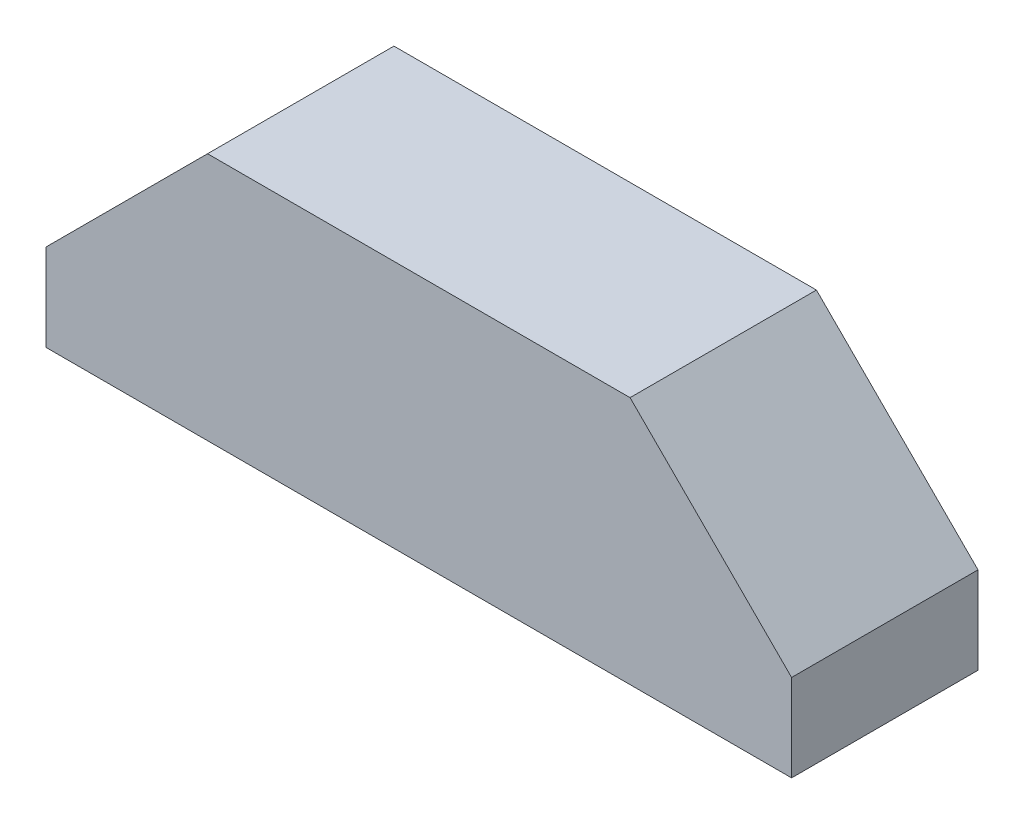
ISO-10303-21;
HEADER;
FILE_DESCRIPTION(('STEP AP214'),'2;1');
FILE_NAME('part.step','',(''),(''),'','','');
FILE_SCHEMA(('AUTOMOTIVE_DESIGN { 1 0 10303 214 1 1 1 1 }'));
ENDSEC;
DATA;
#1=APPLICATION_CONTEXT('core data for automotive mechanical design processes');
#2=APPLICATION_PROTOCOL_DEFINITION('international standard','automotive_design',2000,#1);
#3=PRODUCT_CONTEXT('',#1,'mechanical');
#4=PRODUCT('Part','Part','',(#3));
#5=PRODUCT_RELATED_PRODUCT_CATEGORY('part','',(#4));
#6=PRODUCT_DEFINITION_FORMATION('','',#4);
#7=PRODUCT_DEFINITION_CONTEXT('part definition',#1,'design');
#8=PRODUCT_DEFINITION('design','',#6,#7);
#9=PRODUCT_DEFINITION_SHAPE('','',#8);
#10=(LENGTH_UNIT() NAMED_UNIT(*) SI_UNIT(.MILLI.,.METRE.));
#11=(NAMED_UNIT(*) PLANE_ANGLE_UNIT() SI_UNIT($,.RADIAN.));
#12=(NAMED_UNIT(*) SI_UNIT($,.STERADIAN.) SOLID_ANGLE_UNIT());
#13=UNCERTAINTY_MEASURE_WITH_UNIT(LENGTH_MEASURE(1.E-05),#10,'distance_accuracy_value','');
#14=(GEOMETRIC_REPRESENTATION_CONTEXT(3) GLOBAL_UNCERTAINTY_ASSIGNED_CONTEXT((#13)) GLOBAL_UNIT_ASSIGNED_CONTEXT((#10,
#11,#12)) REPRESENTATION_CONTEXT('',''));
#15=CARTESIAN_POINT('',(0.,0.,0.));
#16=DIRECTION('',(0.,0.,1.));
#17=DIRECTION('',(1.,0.,0.));
#18=AXIS2_PLACEMENT_3D('',#15,#16,#17);
#19=CARTESIAN_POINT('',(3.4,1.80885878693797,3.));
#20=DIRECTION('',(0.707106781186549,0.707106781186546,0.));
#21=DIRECTION('',(-0.707106781186546,0.707106781186549,0.));
#22=AXIS2_PLACEMENT_3D('',#19,#20,#21);
#23=PLANE('',#22);
#24=DIRECTION('',(0.707106781186546,-0.707106781186549,0.));
#25=VECTOR('',#24,1.);
#26=CARTESIAN_POINT('',(3.4,1.80885878693797,0.));
#27=LINE('',#26,#25);
#28=CARTESIAN_POINT('',(3.4,1.80885878693797,0.));
#29=VERTEX_POINT('',#28);
#30=CARTESIAN_POINT('',(6.,-0.791141213062042,0.));
#31=VERTEX_POINT('',#30);
#32=EDGE_CURVE('E127',#29,#31,#27,.T.);
#33=ORIENTED_EDGE('',*,*,#32,.F.);
#34=DIRECTION('',(0.,0.,-1.));
#35=VECTOR('',#34,1.);
#36=CARTESIAN_POINT('',(3.4,1.80885878693797,3.));
#37=LINE('',#36,#35);
#38=CARTESIAN_POINT('',(3.4,1.80885878693797,3.));
#39=VERTEX_POINT('',#38);
#40=EDGE_CURVE('E11',#39,#29,#37,.T.);
#41=ORIENTED_EDGE('',*,*,#40,.F.);
#42=DIRECTION('',(0.707106781186546,-0.707106781186549,0.));
#43=VECTOR('',#42,1.);
#44=CARTESIAN_POINT('',(3.4,1.80885878693797,3.));
#45=LINE('',#44,#43);
#46=CARTESIAN_POINT('',(6.,-0.791141213062042,3.));
#47=VERTEX_POINT('',#46);
#48=EDGE_CURVE('E139',#39,#47,#45,.T.);
#49=ORIENTED_EDGE('',*,*,#48,.T.);
#50=DIRECTION('',(0.,0.,-1.));
#51=VECTOR('',#50,1.);
#52=CARTESIAN_POINT('',(6.,-0.791141213062042,3.));
#53=LINE('',#52,#51);
#54=EDGE_CURVE('E44',#47,#31,#53,.T.);
#55=ORIENTED_EDGE('',*,*,#54,.T.);
#56=EDGE_LOOP('',(#33,#41,#49,#55));
#57=FACE_BOUND('',#56,.T.);
#58=ADVANCED_FACE('F41',(#57),#23,.T.);
#59=CARTESIAN_POINT('',(3.4,1.80885878693797,3.));
#60=DIRECTION('',(0.,-1.,0.));
#61=DIRECTION('',(0.,0.,-1.));
#62=AXIS2_PLACEMENT_3D('',#59,#60,#61);
#63=PLANE('',#62);
#64=DIRECTION('',(-1.,0.,0.));
#65=VECTOR('',#64,1.);
#66=CARTESIAN_POINT('',(3.4,1.80885878693797,0.));
#67=LINE('',#66,#65);
#68=CARTESIAN_POINT('',(-3.4,1.80885878693797,0.));
#69=VERTEX_POINT('',#68);
#70=EDGE_CURVE('E80',#29,#69,#67,.T.);
#71=ORIENTED_EDGE('',*,*,#70,.T.);
#72=DIRECTION('',(0.,0.,-1.));
#73=VECTOR('',#72,1.);
#74=CARTESIAN_POINT('',(-3.4,1.80885878693797,3.));
#75=LINE('',#74,#73);
#76=CARTESIAN_POINT('',(-3.4,1.80885878693797,3.));
#77=VERTEX_POINT('',#76);
#78=EDGE_CURVE('E50',#77,#69,#75,.T.);
#79=ORIENTED_EDGE('',*,*,#78,.F.);
#80=DIRECTION('',(-1.,0.,0.));
#81=VECTOR('',#80,1.);
#82=CARTESIAN_POINT('',(3.4,1.80885878693797,3.));
#83=LINE('',#82,#81);
#84=EDGE_CURVE('E105',#39,#77,#83,.T.);
#85=ORIENTED_EDGE('',*,*,#84,.F.);
#86=ORIENTED_EDGE('',*,*,#40,.T.);
#87=EDGE_LOOP('',(#71,#79,#85,#86));
#88=FACE_BOUND('',#87,.T.);
#89=ADVANCED_FACE('F159',(#88),#63,.F.);
#90=CARTESIAN_POINT('',(-3.4,1.80885878693797,3.));
#91=DIRECTION('',(0.707106781186549,-0.707106781186546,0.));
#92=DIRECTION('',(0.707106781186546,0.707106781186549,0.));
#93=AXIS2_PLACEMENT_3D('',#90,#91,#92);
#94=PLANE('',#93);
#95=DIRECTION('',(-0.707106781186546,-0.707106781186549,0.));
#96=VECTOR('',#95,1.);
#97=CARTESIAN_POINT('',(-3.4,1.80885878693797,0.));
#98=LINE('',#97,#96);
#99=CARTESIAN_POINT('',(-6.,-0.791141213062042,0.));
#100=VERTEX_POINT('',#99);
#101=EDGE_CURVE('E112',#69,#100,#98,.T.);
#102=ORIENTED_EDGE('',*,*,#101,.T.);
#103=DIRECTION('',(0.,0.,-1.));
#104=VECTOR('',#103,1.);
#105=CARTESIAN_POINT('',(-6.,-0.791141213062042,3.));
#106=LINE('',#105,#104);
#107=CARTESIAN_POINT('',(-6.,-0.791141213062042,3.));
#108=VERTEX_POINT('',#107);
#109=EDGE_CURVE('E109',#108,#100,#106,.T.);
#110=ORIENTED_EDGE('',*,*,#109,.F.);
#111=DIRECTION('',(-0.707106781186546,-0.707106781186549,0.));
#112=VECTOR('',#111,1.);
#113=CARTESIAN_POINT('',(-3.4,1.80885878693797,3.));
#114=LINE('',#113,#112);
#115=EDGE_CURVE('E98',#77,#108,#114,.T.);
#116=ORIENTED_EDGE('',*,*,#115,.F.);
#117=ORIENTED_EDGE('',*,*,#78,.T.);
#118=EDGE_LOOP('',(#102,#110,#116,#117));
#119=FACE_BOUND('',#118,.T.);
#120=ADVANCED_FACE('F110',(#119),#94,.F.);
#121=CARTESIAN_POINT('',(-6.,-0.791141213062042,3.));
#122=DIRECTION('',(1.,0.,0.));
#123=DIRECTION('',(0.,0.,-1.));
#124=AXIS2_PLACEMENT_3D('',#121,#122,#123);
#125=PLANE('',#124);
#126=DIRECTION('',(0.,-1.,0.));
#127=VECTOR('',#126,1.);
#128=CARTESIAN_POINT('',(-6.,-0.791141213062042,0.));
#129=LINE('',#128,#127);
#130=CARTESIAN_POINT('',(-6.,-2.19114121306203,0.));
#131=VERTEX_POINT('',#130);
#132=EDGE_CURVE('E136',#100,#131,#129,.T.);
#133=ORIENTED_EDGE('',*,*,#132,.T.);
#134=DIRECTION('',(0.,0.,-1.));
#135=VECTOR('',#134,1.);
#136=CARTESIAN_POINT('',(-6.,-2.19114121306203,3.));
#137=LINE('',#136,#135);
#138=CARTESIAN_POINT('',(-6.,-2.19114121306203,3.));
#139=VERTEX_POINT('',#138);
#140=EDGE_CURVE('E115',#139,#131,#137,.T.);
#141=ORIENTED_EDGE('',*,*,#140,.F.);
#142=DIRECTION('',(0.,-1.,0.));
#143=VECTOR('',#142,1.);
#144=CARTESIAN_POINT('',(-6.,-0.791141213062042,3.));
#145=LINE('',#144,#143);
#146=EDGE_CURVE('E103',#108,#139,#145,.T.);
#147=ORIENTED_EDGE('',*,*,#146,.F.);
#148=ORIENTED_EDGE('',*,*,#109,.T.);
#149=EDGE_LOOP('',(#133,#141,#147,#148));
#150=FACE_BOUND('',#149,.T.);
#151=ADVANCED_FACE('F117',(#150),#125,.F.);
#152=CARTESIAN_POINT('',(-6.,-2.19114121306203,3.));
#153=DIRECTION('',(0.,1.,0.));
#154=DIRECTION('',(0.,0.,1.));
#155=AXIS2_PLACEMENT_3D('',#152,#153,#154);
#156=PLANE('',#155);
#157=DIRECTION('',(1.,0.,0.));
#158=VECTOR('',#157,1.);
#159=CARTESIAN_POINT('',(-6.,-2.19114121306203,0.));
#160=LINE('',#159,#158);
#161=CARTESIAN_POINT('',(6.,-2.19114121306203,0.));
#162=VERTEX_POINT('',#161);
#163=EDGE_CURVE('E133',#131,#162,#160,.T.);
#164=ORIENTED_EDGE('',*,*,#163,.T.);
#165=DIRECTION('',(0.,0.,-1.));
#166=VECTOR('',#165,1.);
#167=CARTESIAN_POINT('',(6.,-2.19114121306203,3.));
#168=LINE('',#167,#166);
#169=CARTESIAN_POINT('',(6.,-2.19114121306203,3.));
#170=VERTEX_POINT('',#169);
#171=EDGE_CURVE('E142',#170,#162,#168,.T.);
#172=ORIENTED_EDGE('',*,*,#171,.F.);
#173=DIRECTION('',(1.,0.,0.));
#174=VECTOR('',#173,1.);
#175=CARTESIAN_POINT('',(-6.,-2.19114121306203,3.));
#176=LINE('',#175,#174);
#177=EDGE_CURVE('E120',#139,#170,#176,.T.);
#178=ORIENTED_EDGE('',*,*,#177,.F.);
#179=ORIENTED_EDGE('',*,*,#140,.T.);
#180=EDGE_LOOP('',(#164,#172,#178,#179));
#181=FACE_BOUND('',#180,.T.);
#182=ADVANCED_FACE('F149',(#181),#156,.F.);
#183=CARTESIAN_POINT('',(6.,-0.791141213062042,3.));
#184=DIRECTION('',(1.,0.,0.));
#185=DIRECTION('',(0.,0.,-1.));
#186=AXIS2_PLACEMENT_3D('',#183,#184,#185);
#187=PLANE('',#186);
#188=DIRECTION('',(0.,-1.,0.));
#189=VECTOR('',#188,1.);
#190=CARTESIAN_POINT('',(6.,-0.791141213062042,0.));
#191=LINE('',#190,#189);
#192=EDGE_CURVE('E130',#31,#162,#191,.T.);
#193=ORIENTED_EDGE('',*,*,#192,.F.);
#194=ORIENTED_EDGE('',*,*,#54,.F.);
#195=DIRECTION('',(0.,-1.,0.));
#196=VECTOR('',#195,1.);
#197=CARTESIAN_POINT('',(6.,-0.791141213062042,3.));
#198=LINE('',#197,#196);
#199=EDGE_CURVE('E122',#47,#170,#198,.T.);
#200=ORIENTED_EDGE('',*,*,#199,.T.);
#201=ORIENTED_EDGE('',*,*,#171,.T.);
#202=EDGE_LOOP('',(#193,#194,#200,#201));
#203=FACE_BOUND('',#202,.T.);
#204=ADVANCED_FACE('F144',(#203),#187,.T.);
#205=CARTESIAN_POINT('',(0.,0.,3.));
#206=DIRECTION('',(0.,0.,-1.));
#207=DIRECTION('',(-1.,0.,0.));
#208=AXIS2_PLACEMENT_3D('',#205,#206,#207);
#209=PLANE('',#208);
#210=ORIENTED_EDGE('',*,*,#48,.F.);
#211=ORIENTED_EDGE('',*,*,#84,.T.);
#212=ORIENTED_EDGE('',*,*,#115,.T.);
#213=ORIENTED_EDGE('',*,*,#146,.T.);
#214=ORIENTED_EDGE('',*,*,#177,.T.);
#215=ORIENTED_EDGE('',*,*,#199,.F.);
#216=EDGE_LOOP('',(#210,#211,#212,#213,#214,#215));
#217=FACE_BOUND('',#216,.T.);
#218=ADVANCED_FACE('F101',(#217),#209,.F.);
#219=CARTESIAN_POINT('',(0.,0.,0.));
#220=DIRECTION('',(0.,0.,-1.));
#221=DIRECTION('',(-1.,0.,0.));
#222=AXIS2_PLACEMENT_3D('',#219,#220,#221);
#223=PLANE('',#222);
#224=ORIENTED_EDGE('',*,*,#32,.T.);
#225=ORIENTED_EDGE('',*,*,#192,.T.);
#226=ORIENTED_EDGE('',*,*,#163,.F.);
#227=ORIENTED_EDGE('',*,*,#132,.F.);
#228=ORIENTED_EDGE('',*,*,#101,.F.);
#229=ORIENTED_EDGE('',*,*,#70,.F.);
#230=EDGE_LOOP('',(#224,#225,#226,#227,#228,#229));
#231=FACE_BOUND('',#230,.T.);
#232=ADVANCED_FACE('F147',(#231),#223,.T.);
#233=CLOSED_SHELL('',(#58,#89,#120,#151,#182,#204,#218,#232));
#234=MANIFOLD_SOLID_BREP('B2',#233);
#235=ADVANCED_BREP_SHAPE_REPRESENTATION('',(#18,#234),#14);
#236=SHAPE_DEFINITION_REPRESENTATION(#9,#235);
ENDSEC;
END-ISO-10303-21;
